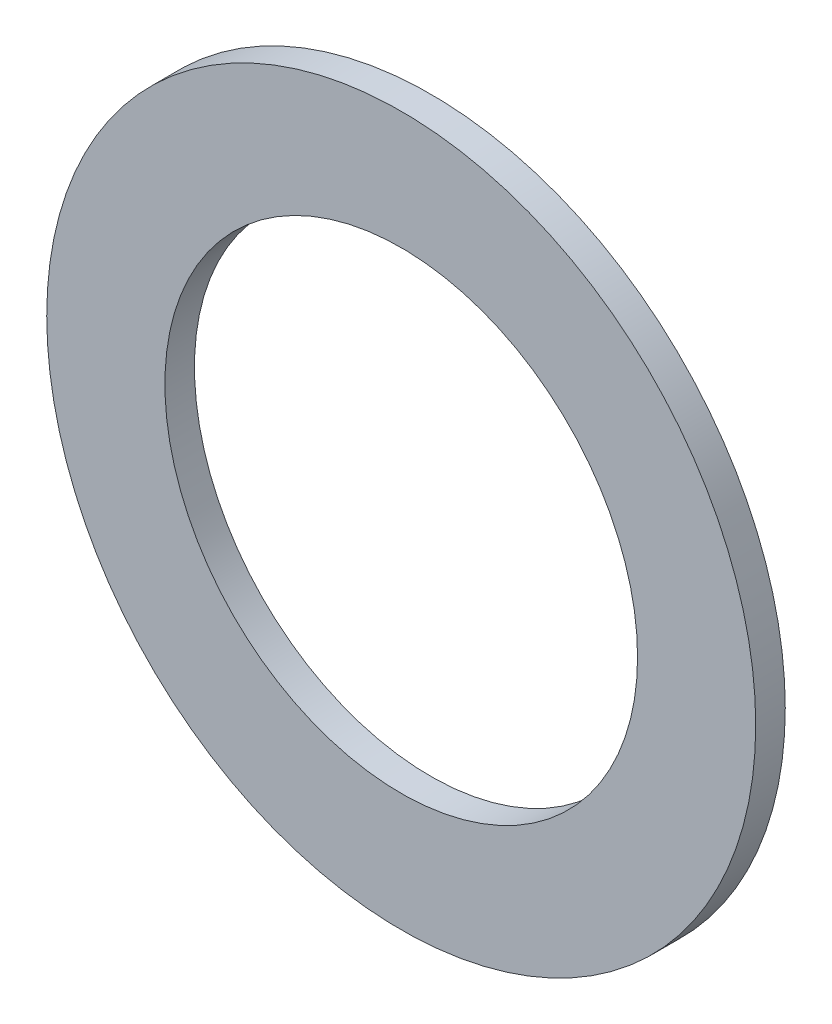
ISO-10303-21;
HEADER;
FILE_DESCRIPTION(('STEP AP214'),'2;1');
FILE_NAME('part.step','',(''),(''),'','','');
FILE_SCHEMA(('AUTOMOTIVE_DESIGN { 1 0 10303 214 1 1 1 1 }'));
ENDSEC;
DATA;
#1=APPLICATION_CONTEXT('core data for automotive mechanical design processes');
#2=APPLICATION_PROTOCOL_DEFINITION('international standard','automotive_design',2000,#1);
#3=PRODUCT_CONTEXT('',#1,'mechanical');
#4=PRODUCT('Part','Part','',(#3));
#5=PRODUCT_RELATED_PRODUCT_CATEGORY('part','',(#4));
#6=PRODUCT_DEFINITION_FORMATION('','',#4);
#7=PRODUCT_DEFINITION_CONTEXT('part definition',#1,'design');
#8=PRODUCT_DEFINITION('design','',#6,#7);
#9=PRODUCT_DEFINITION_SHAPE('','',#8);
#10=(LENGTH_UNIT() NAMED_UNIT(*) SI_UNIT(.MILLI.,.METRE.));
#11=(NAMED_UNIT(*) PLANE_ANGLE_UNIT() SI_UNIT($,.RADIAN.));
#12=(NAMED_UNIT(*) SI_UNIT($,.STERADIAN.) SOLID_ANGLE_UNIT());
#13=UNCERTAINTY_MEASURE_WITH_UNIT(LENGTH_MEASURE(1.E-05),#10,'distance_accuracy_value','');
#14=(GEOMETRIC_REPRESENTATION_CONTEXT(3) GLOBAL_UNCERTAINTY_ASSIGNED_CONTEXT((#13)) GLOBAL_UNIT_ASSIGNED_CONTEXT((#10,
#11,#12)) REPRESENTATION_CONTEXT('',''));
#15=CARTESIAN_POINT('',(0.,0.,0.));
#16=DIRECTION('',(0.,0.,1.));
#17=DIRECTION('',(1.,0.,0.));
#18=AXIS2_PLACEMENT_3D('',#15,#16,#17);
#19=CARTESIAN_POINT('',(0.,0.,1.));
#20=DIRECTION('',(0.,0.,-1.));
#21=DIRECTION('',(-1.,0.,0.));
#22=AXIS2_PLACEMENT_3D('',#19,#20,#21);
#23=CYLINDRICAL_SURFACE('',#22,12.);
#24=CARTESIAN_POINT('',(0.,0.,1.));
#25=DIRECTION('',(0.,0.,1.));
#26=DIRECTION('',(1.,0.,0.));
#27=AXIS2_PLACEMENT_3D('',#24,#25,#26);
#28=CIRCLE('',#27,12.);
#29=CARTESIAN_POINT('',(12.,0.,1.));
#30=VERTEX_POINT('',#29);
#31=EDGE_CURVE('E10',#30,#30,#28,.T.);
#32=ORIENTED_EDGE('',*,*,#31,.F.);
#33=EDGE_LOOP('',(#32));
#34=FACE_BOUND('',#33,.T.);
#35=CARTESIAN_POINT('',(0.,0.,0.));
#36=DIRECTION('',(0.,0.,1.));
#37=DIRECTION('',(1.,0.,0.));
#38=AXIS2_PLACEMENT_3D('',#35,#36,#37);
#39=CIRCLE('',#38,12.);
#40=CARTESIAN_POINT('',(12.,0.,0.));
#41=VERTEX_POINT('',#40);
#42=EDGE_CURVE('E35',#41,#41,#39,.T.);
#43=ORIENTED_EDGE('',*,*,#42,.T.);
#44=EDGE_LOOP('',(#43));
#45=FACE_BOUND('',#44,.T.);
#46=ADVANCED_FACE('F32',(#34,#45),#23,.T.);
#47=CARTESIAN_POINT('',(0.,0.,1.));
#48=DIRECTION('',(0.,0.,1.));
#49=DIRECTION('',(1.,0.,0.));
#50=AXIS2_PLACEMENT_3D('',#47,#48,#49);
#51=PLANE('',#50);
#52=CARTESIAN_POINT('',(0.,0.,1.));
#53=DIRECTION('',(0.,0.,1.));
#54=DIRECTION('',(1.,0.,0.));
#55=AXIS2_PLACEMENT_3D('',#52,#53,#54);
#56=CIRCLE('',#55,8.);
#57=CARTESIAN_POINT('',(8.,0.,1.));
#58=VERTEX_POINT('',#57);
#59=EDGE_CURVE('E44',#58,#58,#56,.T.);
#60=ORIENTED_EDGE('',*,*,#59,.F.);
#61=EDGE_LOOP('',(#60));
#62=FACE_BOUND('',#61,.T.);
#63=ORIENTED_EDGE('',*,*,#31,.T.);
#64=EDGE_LOOP('',(#63));
#65=FACE_BOUND('',#64,.T.);
#66=ADVANCED_FACE('F59',(#62,#65),#51,.T.);
#67=CARTESIAN_POINT('',(0.,0.,0.));
#68=DIRECTION('',(0.,0.,1.));
#69=DIRECTION('',(1.,0.,0.));
#70=AXIS2_PLACEMENT_3D('',#67,#68,#69);
#71=PLANE('',#70);
#72=CARTESIAN_POINT('',(0.,0.,0.));
#73=DIRECTION('',(0.,0.,1.));
#74=DIRECTION('',(1.,0.,0.));
#75=AXIS2_PLACEMENT_3D('',#72,#73,#74);
#76=CIRCLE('',#75,8.);
#77=CARTESIAN_POINT('',(8.,0.,0.));
#78=VERTEX_POINT('',#77);
#79=EDGE_CURVE('E42',#78,#78,#76,.T.);
#80=ORIENTED_EDGE('',*,*,#79,.T.);
#81=EDGE_LOOP('',(#80));
#82=FACE_BOUND('',#81,.T.);
#83=ORIENTED_EDGE('',*,*,#42,.F.);
#84=EDGE_LOOP('',(#83));
#85=FACE_BOUND('',#84,.T.);
#86=ADVANCED_FACE('F50',(#82,#85),#71,.F.);
#87=CARTESIAN_POINT('',(0.,0.,0.));
#88=DIRECTION('',(0.,0.,1.));
#89=DIRECTION('',(1.,0.,0.));
#90=AXIS2_PLACEMENT_3D('',#87,#88,#89);
#91=CYLINDRICAL_SURFACE('',#90,8.);
#92=ORIENTED_EDGE('',*,*,#79,.F.);
#93=EDGE_LOOP('',(#92));
#94=FACE_BOUND('',#93,.T.);
#95=ORIENTED_EDGE('',*,*,#59,.T.);
#96=EDGE_LOOP('',(#95));
#97=FACE_BOUND('',#96,.T.);
#98=ADVANCED_FACE('F53',(#94,#97),#91,.F.);
#99=CLOSED_SHELL('',(#46,#66,#86,#98));
#100=MANIFOLD_SOLID_BREP('B2',#99);
#101=ADVANCED_BREP_SHAPE_REPRESENTATION('',(#18,#100),#14);
#102=SHAPE_DEFINITION_REPRESENTATION(#9,#101);
ENDSEC;
END-ISO-10303-21;
